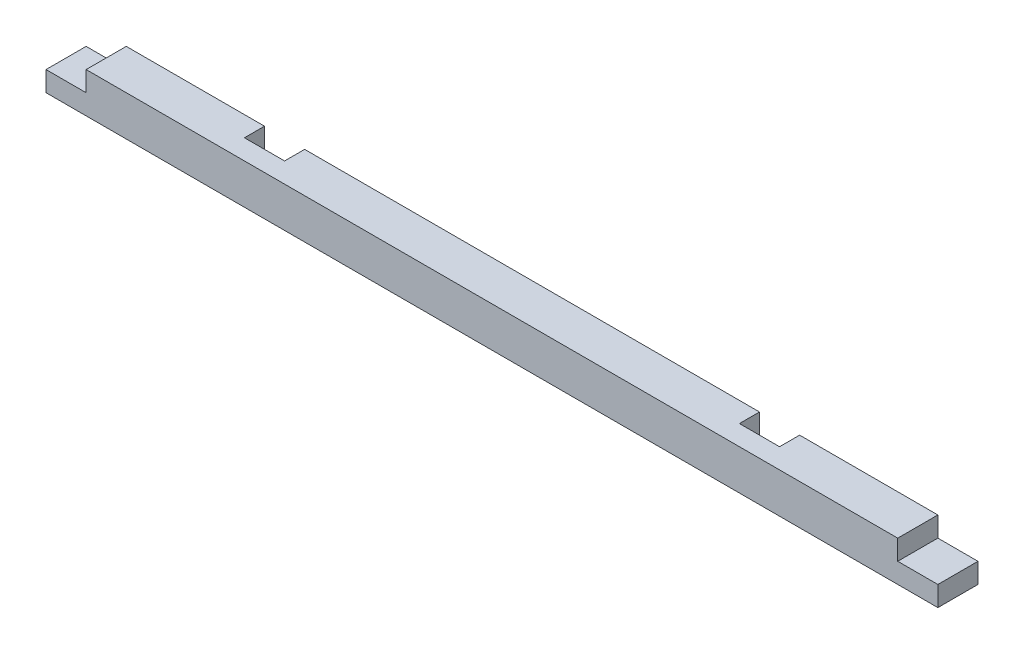
ISO-10303-21;
HEADER;
FILE_DESCRIPTION(('STEP AP214'),'2;1');
FILE_NAME('part.step','',(''),(''),'','','');
FILE_SCHEMA(('AUTOMOTIVE_DESIGN { 1 0 10303 214 1 1 1 1 }'));
ENDSEC;
DATA;
#1=APPLICATION_CONTEXT('core data for automotive mechanical design processes');
#2=APPLICATION_PROTOCOL_DEFINITION('international standard','automotive_design',2000,#1);
#3=PRODUCT_CONTEXT('',#1,'mechanical');
#4=PRODUCT('Part','Part','',(#3));
#5=PRODUCT_RELATED_PRODUCT_CATEGORY('part','',(#4));
#6=PRODUCT_DEFINITION_FORMATION('','',#4);
#7=PRODUCT_DEFINITION_CONTEXT('part definition',#1,'design');
#8=PRODUCT_DEFINITION('design','',#6,#7);
#9=PRODUCT_DEFINITION_SHAPE('','',#8);
#10=(LENGTH_UNIT() NAMED_UNIT(*) SI_UNIT(.MILLI.,.METRE.));
#11=(NAMED_UNIT(*) PLANE_ANGLE_UNIT() SI_UNIT($,.RADIAN.));
#12=(NAMED_UNIT(*) SI_UNIT($,.STERADIAN.) SOLID_ANGLE_UNIT());
#13=UNCERTAINTY_MEASURE_WITH_UNIT(LENGTH_MEASURE(1.E-05),#10,'distance_accuracy_value','');
#14=(GEOMETRIC_REPRESENTATION_CONTEXT(3) GLOBAL_UNCERTAINTY_ASSIGNED_CONTEXT((#13)) GLOBAL_UNIT_ASSIGNED_CONTEXT((#10,
#11,#12)) REPRESENTATION_CONTEXT('',''));
#15=CARTESIAN_POINT('',(0.,0.,0.));
#16=DIRECTION('',(0.,0.,1.));
#17=DIRECTION('',(1.,0.,0.));
#18=AXIS2_PLACEMENT_3D('',#15,#16,#17);
#19=CARTESIAN_POINT('',(2000.,0.,-90.));
#20=DIRECTION('',(0.,0.,1.));
#21=DIRECTION('',(0.,-1.,0.));
#22=AXIS2_PLACEMENT_3D('',#19,#20,#21);
#23=PLANE('',#22);
#24=DIRECTION('',(-1.,0.,0.));
#25=VECTOR('',#24,1.);
#26=CARTESIAN_POINT('',(2000.,90.,-90.));
#27=LINE('',#26,#25);
#28=CARTESIAN_POINT('',(400.,90.,-90.));
#29=VERTEX_POINT('',#28);
#30=CARTESIAN_POINT('',(90.,90.,-90.));
#31=VERTEX_POINT('',#30);
#32=EDGE_CURVE('E248',#29,#31,#27,.T.);
#33=ORIENTED_EDGE('',*,*,#32,.F.);
#34=DIRECTION('',(0.,1.,0.));
#35=VECTOR('',#34,1.);
#36=CARTESIAN_POINT('',(400.,90.,-90.));
#37=LINE('',#36,#35);
#38=CARTESIAN_POINT('',(400.,0.,-90.));
#39=VERTEX_POINT('',#38);
#40=EDGE_CURVE('E265',#39,#29,#37,.T.);
#41=ORIENTED_EDGE('',*,*,#40,.F.);
#42=DIRECTION('',(-1.,0.,0.));
#43=VECTOR('',#42,1.);
#44=CARTESIAN_POINT('',(2000.,0.,-90.));
#45=LINE('',#44,#43);
#46=CARTESIAN_POINT('',(0.,0.,-90.));
#47=VERTEX_POINT('',#46);
#48=EDGE_CURVE('E251',#39,#47,#45,.T.);
#49=ORIENTED_EDGE('',*,*,#48,.T.);
#50=DIRECTION('',(0.,1.,0.));
#51=VECTOR('',#50,1.);
#52=CARTESIAN_POINT('',(0.,0.,-90.));
#53=LINE('',#52,#51);
#54=CARTESIAN_POINT('',(0.,45.,-90.));
#55=VERTEX_POINT('',#54);
#56=EDGE_CURVE('E235',#47,#55,#53,.T.);
#57=ORIENTED_EDGE('',*,*,#56,.T.);
#58=DIRECTION('',(-1.,0.,0.));
#59=VECTOR('',#58,1.);
#60=CARTESIAN_POINT('',(0.,45.,-90.));
#61=LINE('',#60,#59);
#62=CARTESIAN_POINT('',(90.,45.,-90.));
#63=VERTEX_POINT('',#62);
#64=EDGE_CURVE('E221',#63,#55,#61,.T.);
#65=ORIENTED_EDGE('',*,*,#64,.F.);
#66=DIRECTION('',(0.,1.,0.));
#67=VECTOR('',#66,1.);
#68=CARTESIAN_POINT('',(90.,45.,-90.));
#69=LINE('',#68,#67);
#70=EDGE_CURVE('E226',#63,#31,#69,.T.);
#71=ORIENTED_EDGE('',*,*,#70,.T.);
#72=EDGE_LOOP('',(#33,#41,#49,#57,#65,#71));
#73=FACE_BOUND('',#72,.T.);
#74=ADVANCED_FACE('F32',(#73),#23,.F.);
#75=CARTESIAN_POINT('',(2000.,0.,-90.));
#76=VERTEX_POINT('',#75);
#77=CARTESIAN_POINT('',(1600.,0.,-90.));
#78=VERTEX_POINT('',#77);
#79=EDGE_CURVE('E40',#76,#78,#45,.T.);
#80=ORIENTED_EDGE('',*,*,#79,.T.);
#81=DIRECTION('',(0.,-1.,0.));
#82=VECTOR('',#81,1.);
#83=CARTESIAN_POINT('',(1600.,90.,-90.));
#84=LINE('',#83,#82);
#85=CARTESIAN_POINT('',(1600.,90.,-90.));
#86=VERTEX_POINT('',#85);
#87=EDGE_CURVE('E184',#86,#78,#84,.T.);
#88=ORIENTED_EDGE('',*,*,#87,.F.);
#89=CARTESIAN_POINT('',(1910.,90.,-90.));
#90=VERTEX_POINT('',#89);
#91=EDGE_CURVE('E249',#90,#86,#27,.T.);
#92=ORIENTED_EDGE('',*,*,#91,.F.);
#93=DIRECTION('',(0.,1.,0.));
#94=VECTOR('',#93,1.);
#95=CARTESIAN_POINT('',(1910.,45.,-90.));
#96=LINE('',#95,#94);
#97=CARTESIAN_POINT('',(1910.,45.,-90.));
#98=VERTEX_POINT('',#97);
#99=EDGE_CURVE('E206',#98,#90,#96,.T.);
#100=ORIENTED_EDGE('',*,*,#99,.F.);
#101=DIRECTION('',(-1.,0.,0.));
#102=VECTOR('',#101,1.);
#103=CARTESIAN_POINT('',(2000.,45.,-90.));
#104=LINE('',#103,#102);
#105=CARTESIAN_POINT('',(2000.,45.,-90.));
#106=VERTEX_POINT('',#105);
#107=EDGE_CURVE('E198',#106,#98,#104,.T.);
#108=ORIENTED_EDGE('',*,*,#107,.F.);
#109=DIRECTION('',(0.,1.,0.));
#110=VECTOR('',#109,1.);
#111=CARTESIAN_POINT('',(2000.,0.,-90.));
#112=LINE('',#111,#110);
#113=EDGE_CURVE('E237',#76,#106,#112,.T.);
#114=ORIENTED_EDGE('',*,*,#113,.F.);
#115=EDGE_LOOP('',(#80,#88,#92,#100,#108,#114));
#116=FACE_BOUND('',#115,.T.);
#117=ADVANCED_FACE('F308',(#116),#23,.F.);
#118=CARTESIAN_POINT('',(0.,0.,0.));
#119=DIRECTION('',(-1.,0.,0.));
#120=DIRECTION('',(0.,0.,1.));
#121=AXIS2_PLACEMENT_3D('',#118,#119,#120);
#122=PLANE('',#121);
#123=DIRECTION('',(0.,-1.,0.));
#124=VECTOR('',#123,1.);
#125=CARTESIAN_POINT('',(0.,0.,0.));
#126=LINE('',#125,#124);
#127=CARTESIAN_POINT('',(0.,45.,0.));
#128=VERTEX_POINT('',#127);
#129=CARTESIAN_POINT('',(0.,0.,0.));
#130=VERTEX_POINT('',#129);
#131=EDGE_CURVE('E229',#128,#130,#126,.T.);
#132=ORIENTED_EDGE('',*,*,#131,.F.);
#133=DIRECTION('',(0.,0.,1.));
#134=VECTOR('',#133,1.);
#135=CARTESIAN_POINT('',(0.,45.,-90.));
#136=LINE('',#135,#134);
#137=EDGE_CURVE('E213',#55,#128,#136,.T.);
#138=ORIENTED_EDGE('',*,*,#137,.F.);
#139=ORIENTED_EDGE('',*,*,#56,.F.);
#140=DIRECTION('',(0.,0.,-1.));
#141=VECTOR('',#140,1.);
#142=CARTESIAN_POINT('',(0.,0.,0.));
#143=LINE('',#142,#141);
#144=EDGE_CURVE('E242',#130,#47,#143,.T.);
#145=ORIENTED_EDGE('',*,*,#144,.F.);
#146=EDGE_LOOP('',(#132,#138,#139,#145));
#147=FACE_BOUND('',#146,.T.);
#148=ADVANCED_FACE('F275',(#147),#122,.T.);
#149=CARTESIAN_POINT('',(2000.,0.,0.));
#150=DIRECTION('',(0.,0.,-1.));
#151=DIRECTION('',(0.,1.,0.));
#152=AXIS2_PLACEMENT_3D('',#149,#150,#151);
#153=PLANE('',#152);
#154=DIRECTION('',(1.,0.,0.));
#155=VECTOR('',#154,1.);
#156=CARTESIAN_POINT('',(2000.,45.,0.));
#157=LINE('',#156,#155);
#158=CARTESIAN_POINT('',(1910.,45.,0.));
#159=VERTEX_POINT('',#158);
#160=CARTESIAN_POINT('',(2000.,45.,0.));
#161=VERTEX_POINT('',#160);
#162=EDGE_CURVE('E204',#159,#161,#157,.T.);
#163=ORIENTED_EDGE('',*,*,#162,.F.);
#164=DIRECTION('',(0.,1.,0.));
#165=VECTOR('',#164,1.);
#166=CARTESIAN_POINT('',(1910.,45.,0.));
#167=LINE('',#166,#165);
#168=CARTESIAN_POINT('',(1910.,90.,0.));
#169=VERTEX_POINT('',#168);
#170=EDGE_CURVE('E208',#159,#169,#167,.T.);
#171=ORIENTED_EDGE('',*,*,#170,.T.);
#172=DIRECTION('',(-1.,0.,0.));
#173=VECTOR('',#172,1.);
#174=CARTESIAN_POINT('',(2000.,90.,0.));
#175=LINE('',#174,#173);
#176=CARTESIAN_POINT('',(90.0000000000001,90.,0.));
#177=VERTEX_POINT('',#176);
#178=EDGE_CURVE('E240',#169,#177,#175,.T.);
#179=ORIENTED_EDGE('',*,*,#178,.T.);
#180=DIRECTION('',(0.,1.,0.));
#181=VECTOR('',#180,1.);
#182=CARTESIAN_POINT('',(90.0000000000001,45.,0.));
#183=LINE('',#182,#181);
#184=CARTESIAN_POINT('',(90.0000000000001,45.,0.));
#185=VERTEX_POINT('',#184);
#186=EDGE_CURVE('E223',#185,#177,#183,.T.);
#187=ORIENTED_EDGE('',*,*,#186,.F.);
#188=DIRECTION('',(1.,0.,0.));
#189=VECTOR('',#188,1.);
#190=CARTESIAN_POINT('',(0.,45.,0.));
#191=LINE('',#190,#189);
#192=EDGE_CURVE('E215',#128,#185,#191,.T.);
#193=ORIENTED_EDGE('',*,*,#192,.F.);
#194=ORIENTED_EDGE('',*,*,#131,.T.);
#195=DIRECTION('',(-1.,0.,0.));
#196=VECTOR('',#195,1.);
#197=CARTESIAN_POINT('',(2000.,0.,0.));
#198=LINE('',#197,#196);
#199=CARTESIAN_POINT('',(2000.,0.,0.));
#200=VERTEX_POINT('',#199);
#201=EDGE_CURVE('E11',#200,#130,#198,.T.);
#202=ORIENTED_EDGE('',*,*,#201,.F.);
#203=DIRECTION('',(0.,-1.,0.));
#204=VECTOR('',#203,1.);
#205=CARTESIAN_POINT('',(2000.,0.,0.));
#206=LINE('',#205,#204);
#207=EDGE_CURVE('E232',#161,#200,#206,.T.);
#208=ORIENTED_EDGE('',*,*,#207,.F.);
#209=EDGE_LOOP('',(#163,#171,#179,#187,#193,#194,#202,#208));
#210=FACE_BOUND('',#209,.T.);
#211=ADVANCED_FACE('F34',(#210),#153,.F.);
#212=CARTESIAN_POINT('',(2000.,0.,0.));
#213=DIRECTION('',(0.,1.,0.));
#214=DIRECTION('',(0.,0.,1.));
#215=AXIS2_PLACEMENT_3D('',#212,#213,#214);
#216=PLANE('',#215);
#217=ORIENTED_EDGE('',*,*,#48,.F.);
#218=DIRECTION('',(0.,0.,-1.));
#219=VECTOR('',#218,1.);
#220=CARTESIAN_POINT('',(400.,0.,-45.));
#221=LINE('',#220,#219);
#222=CARTESIAN_POINT('',(400.,0.,-45.));
#223=VERTEX_POINT('',#222);
#224=EDGE_CURVE('E169',#223,#39,#221,.T.);
#225=ORIENTED_EDGE('',*,*,#224,.F.);
#226=DIRECTION('',(-1.,0.,0.));
#227=VECTOR('',#226,1.);
#228=CARTESIAN_POINT('',(400.,0.,-45.));
#229=LINE('',#228,#227);
#230=CARTESIAN_POINT('',(490.,0.,-45.));
#231=VERTEX_POINT('',#230);
#232=EDGE_CURVE('E154',#231,#223,#229,.T.);
#233=ORIENTED_EDGE('',*,*,#232,.F.);
#234=DIRECTION('',(0.,0.,-1.));
#235=VECTOR('',#234,1.);
#236=CARTESIAN_POINT('',(490.,0.,-45.));
#237=LINE('',#236,#235);
#238=CARTESIAN_POINT('',(490.,0.,-90.));
#239=VERTEX_POINT('',#238);
#240=EDGE_CURVE('E152',#231,#239,#237,.T.);
#241=ORIENTED_EDGE('',*,*,#240,.T.);
#242=CARTESIAN_POINT('',(1510.,0.,-90.));
#243=VERTEX_POINT('',#242);
#244=EDGE_CURVE('E253',#243,#239,#45,.T.);
#245=ORIENTED_EDGE('',*,*,#244,.F.);
#246=DIRECTION('',(0.,0.,-1.));
#247=VECTOR('',#246,1.);
#248=CARTESIAN_POINT('',(1510.,0.,-45.));
#249=LINE('',#248,#247);
#250=CARTESIAN_POINT('',(1510.,0.,-45.));
#251=VERTEX_POINT('',#250);
#252=EDGE_CURVE('E192',#251,#243,#249,.T.);
#253=ORIENTED_EDGE('',*,*,#252,.F.);
#254=DIRECTION('',(-1.,0.,0.));
#255=VECTOR('',#254,1.);
#256=CARTESIAN_POINT('',(1600.,0.,-45.));
#257=LINE('',#256,#255);
#258=CARTESIAN_POINT('',(1600.,0.,-45.));
#259=VERTEX_POINT('',#258);
#260=EDGE_CURVE('E177',#259,#251,#257,.T.);
#261=ORIENTED_EDGE('',*,*,#260,.F.);
#262=DIRECTION('',(0.,0.,-1.));
#263=VECTOR('',#262,1.);
#264=CARTESIAN_POINT('',(1600.,0.,-45.));
#265=LINE('',#264,#263);
#266=EDGE_CURVE('E183',#259,#78,#265,.T.);
#267=ORIENTED_EDGE('',*,*,#266,.T.);
#268=ORIENTED_EDGE('',*,*,#79,.F.);
#269=DIRECTION('',(0.,0.,-1.));
#270=VECTOR('',#269,1.);
#271=CARTESIAN_POINT('',(2000.,0.,0.));
#272=LINE('',#271,#270);
#273=EDGE_CURVE('E234',#200,#76,#272,.T.);
#274=ORIENTED_EDGE('',*,*,#273,.F.);
#275=ORIENTED_EDGE('',*,*,#201,.T.);
#276=ORIENTED_EDGE('',*,*,#144,.T.);
#277=EDGE_LOOP('',(#217,#225,#233,#241,#245,#253,#261,#267,#268,#274,#275,#276));
#278=FACE_BOUND('',#277,.T.);
#279=ADVANCED_FACE('F269',(#278),#216,.F.);
#280=ORIENTED_EDGE('',*,*,#244,.T.);
#281=DIRECTION('',(0.,-1.,0.));
#282=VECTOR('',#281,1.);
#283=CARTESIAN_POINT('',(490.,90.,-90.));
#284=LINE('',#283,#282);
#285=CARTESIAN_POINT('',(490.,90.,-90.));
#286=VERTEX_POINT('',#285);
#287=EDGE_CURVE('E289',#286,#239,#284,.T.);
#288=ORIENTED_EDGE('',*,*,#287,.F.);
#289=CARTESIAN_POINT('',(1510.,90.,-90.));
#290=VERTEX_POINT('',#289);
#291=EDGE_CURVE('E166',#290,#286,#27,.T.);
#292=ORIENTED_EDGE('',*,*,#291,.F.);
#293=DIRECTION('',(0.,1.,0.));
#294=VECTOR('',#293,1.);
#295=CARTESIAN_POINT('',(1510.,90.,-90.));
#296=LINE('',#295,#294);
#297=EDGE_CURVE('E178',#243,#290,#296,.T.);
#298=ORIENTED_EDGE('',*,*,#297,.F.);
#299=EDGE_LOOP('',(#280,#288,#292,#298));
#300=FACE_BOUND('',#299,.T.);
#301=ADVANCED_FACE('F298',(#300),#23,.F.);
#302=CARTESIAN_POINT('',(2000.,90.,0.));
#303=DIRECTION('',(0.,-1.,0.));
#304=DIRECTION('',(0.,0.,-1.));
#305=AXIS2_PLACEMENT_3D('',#302,#303,#304);
#306=PLANE('',#305);
#307=DIRECTION('',(1.,0.,0.));
#308=VECTOR('',#307,1.);
#309=CARTESIAN_POINT('',(400.,90.,-45.));
#310=LINE('',#309,#308);
#311=CARTESIAN_POINT('',(400.,90.,-45.));
#312=VERTEX_POINT('',#311);
#313=CARTESIAN_POINT('',(490.,90.,-45.));
#314=VERTEX_POINT('',#313);
#315=EDGE_CURVE('E155',#312,#314,#310,.T.);
#316=ORIENTED_EDGE('',*,*,#315,.F.);
#317=DIRECTION('',(0.,0.,-1.));
#318=VECTOR('',#317,1.);
#319=CARTESIAN_POINT('',(400.,90.,-45.));
#320=LINE('',#319,#318);
#321=EDGE_CURVE('E167',#312,#29,#320,.T.);
#322=ORIENTED_EDGE('',*,*,#321,.T.);
#323=ORIENTED_EDGE('',*,*,#32,.T.);
#324=DIRECTION('',(0.,0.,-1.));
#325=VECTOR('',#324,1.);
#326=CARTESIAN_POINT('',(90.,90.,-90.));
#327=LINE('',#326,#325);
#328=EDGE_CURVE('E211',#177,#31,#327,.T.);
#329=ORIENTED_EDGE('',*,*,#328,.F.);
#330=ORIENTED_EDGE('',*,*,#178,.F.);
#331=DIRECTION('',(0.,0.,1.));
#332=VECTOR('',#331,1.);
#333=CARTESIAN_POINT('',(1910.,90.,-90.));
#334=LINE('',#333,#332);
#335=EDGE_CURVE('E189',#90,#169,#334,.T.);
#336=ORIENTED_EDGE('',*,*,#335,.F.);
#337=ORIENTED_EDGE('',*,*,#91,.T.);
#338=DIRECTION('',(0.,0.,-1.));
#339=VECTOR('',#338,1.);
#340=CARTESIAN_POINT('',(1600.,90.,-45.));
#341=LINE('',#340,#339);
#342=CARTESIAN_POINT('',(1600.,90.,-45.));
#343=VERTEX_POINT('',#342);
#344=EDGE_CURVE('E187',#343,#86,#341,.T.);
#345=ORIENTED_EDGE('',*,*,#344,.F.);
#346=DIRECTION('',(1.,0.,0.));
#347=VECTOR('',#346,1.);
#348=CARTESIAN_POINT('',(1600.,90.,-45.));
#349=LINE('',#348,#347);
#350=CARTESIAN_POINT('',(1510.,90.,-45.));
#351=VERTEX_POINT('',#350);
#352=EDGE_CURVE('E181',#351,#343,#349,.T.);
#353=ORIENTED_EDGE('',*,*,#352,.F.);
#354=DIRECTION('',(0.,0.,-1.));
#355=VECTOR('',#354,1.);
#356=CARTESIAN_POINT('',(1510.,90.,-45.));
#357=LINE('',#356,#355);
#358=EDGE_CURVE('E190',#351,#290,#357,.T.);
#359=ORIENTED_EDGE('',*,*,#358,.T.);
#360=ORIENTED_EDGE('',*,*,#291,.T.);
#361=DIRECTION('',(0.,0.,-1.));
#362=VECTOR('',#361,1.);
#363=CARTESIAN_POINT('',(490.,90.,-45.));
#364=LINE('',#363,#362);
#365=EDGE_CURVE('E149',#314,#286,#364,.T.);
#366=ORIENTED_EDGE('',*,*,#365,.F.);
#367=EDGE_LOOP('',(#316,#322,#323,#329,#330,#336,#337,#345,#353,#359,#360,#366));
#368=FACE_BOUND('',#367,.T.);
#369=ADVANCED_FACE('F163',(#368),#306,.F.);
#370=CARTESIAN_POINT('',(2000.,0.,0.));
#371=DIRECTION('',(-1.,0.,0.));
#372=DIRECTION('',(0.,0.,1.));
#373=AXIS2_PLACEMENT_3D('',#370,#371,#372);
#374=PLANE('',#373);
#375=ORIENTED_EDGE('',*,*,#113,.T.);
#376=DIRECTION('',(0.,0.,-1.));
#377=VECTOR('',#376,1.);
#378=CARTESIAN_POINT('',(2000.,45.,-90.));
#379=LINE('',#378,#377);
#380=EDGE_CURVE('E196',#161,#106,#379,.T.);
#381=ORIENTED_EDGE('',*,*,#380,.F.);
#382=ORIENTED_EDGE('',*,*,#207,.T.);
#383=ORIENTED_EDGE('',*,*,#273,.T.);
#384=EDGE_LOOP('',(#375,#381,#382,#383));
#385=FACE_BOUND('',#384,.T.);
#386=ADVANCED_FACE('F318',(#385),#374,.F.);
#387=CARTESIAN_POINT('',(90.,45.,-90.));
#388=DIRECTION('',(1.,0.,0.));
#389=DIRECTION('',(0.,0.,-1.));
#390=AXIS2_PLACEMENT_3D('',#387,#388,#389);
#391=PLANE('',#390);
#392=ORIENTED_EDGE('',*,*,#328,.T.);
#393=ORIENTED_EDGE('',*,*,#70,.F.);
#394=DIRECTION('',(0.,0.,-1.));
#395=VECTOR('',#394,1.);
#396=CARTESIAN_POINT('',(90.,45.,-90.));
#397=LINE('',#396,#395);
#398=EDGE_CURVE('E218',#185,#63,#397,.T.);
#399=ORIENTED_EDGE('',*,*,#398,.F.);
#400=ORIENTED_EDGE('',*,*,#186,.T.);
#401=EDGE_LOOP('',(#392,#393,#399,#400));
#402=FACE_BOUND('',#401,.T.);
#403=ADVANCED_FACE('F285',(#402),#391,.F.);
#404=CARTESIAN_POINT('',(0.,45.,0.));
#405=DIRECTION('',(0.,1.,0.));
#406=DIRECTION('',(0.,0.,1.));
#407=AXIS2_PLACEMENT_3D('',#404,#405,#406);
#408=PLANE('',#407);
#409=ORIENTED_EDGE('',*,*,#137,.T.);
#410=ORIENTED_EDGE('',*,*,#192,.T.);
#411=ORIENTED_EDGE('',*,*,#398,.T.);
#412=ORIENTED_EDGE('',*,*,#64,.T.);
#413=EDGE_LOOP('',(#409,#410,#411,#412));
#414=FACE_BOUND('',#413,.T.);
#415=ADVANCED_FACE('F278',(#414),#408,.T.);
#416=CARTESIAN_POINT('',(1910.,45.,-90.));
#417=DIRECTION('',(-1.,0.,0.));
#418=DIRECTION('',(0.,0.,1.));
#419=AXIS2_PLACEMENT_3D('',#416,#417,#418);
#420=PLANE('',#419);
#421=ORIENTED_EDGE('',*,*,#335,.T.);
#422=ORIENTED_EDGE('',*,*,#170,.F.);
#423=DIRECTION('',(0.,0.,1.));
#424=VECTOR('',#423,1.);
#425=CARTESIAN_POINT('',(1910.,45.,-90.));
#426=LINE('',#425,#424);
#427=EDGE_CURVE('E201',#98,#159,#426,.T.);
#428=ORIENTED_EDGE('',*,*,#427,.F.);
#429=ORIENTED_EDGE('',*,*,#99,.T.);
#430=EDGE_LOOP('',(#421,#422,#428,#429));
#431=FACE_BOUND('',#430,.T.);
#432=ADVANCED_FACE('F311',(#431),#420,.F.);
#433=CARTESIAN_POINT('',(0.,45.,0.));
#434=DIRECTION('',(0.,-1.,0.));
#435=DIRECTION('',(0.,0.,-1.));
#436=AXIS2_PLACEMENT_3D('',#433,#434,#435);
#437=PLANE('',#436);
#438=ORIENTED_EDGE('',*,*,#380,.T.);
#439=ORIENTED_EDGE('',*,*,#107,.T.);
#440=ORIENTED_EDGE('',*,*,#427,.T.);
#441=ORIENTED_EDGE('',*,*,#162,.T.);
#442=EDGE_LOOP('',(#438,#439,#440,#441));
#443=FACE_BOUND('',#442,.T.);
#444=ADVANCED_FACE('F315',(#443),#437,.F.);
#445=CARTESIAN_POINT('',(1600.,90.,-45.));
#446=DIRECTION('',(1.,0.,0.));
#447=DIRECTION('',(0.,0.,-1.));
#448=AXIS2_PLACEMENT_3D('',#445,#446,#447);
#449=PLANE('',#448);
#450=ORIENTED_EDGE('',*,*,#87,.T.);
#451=ORIENTED_EDGE('',*,*,#266,.F.);
#452=DIRECTION('',(0.,-1.,0.));
#453=VECTOR('',#452,1.);
#454=CARTESIAN_POINT('',(1600.,90.,-45.));
#455=LINE('',#454,#453);
#456=EDGE_CURVE('E174',#343,#259,#455,.T.);
#457=ORIENTED_EDGE('',*,*,#456,.F.);
#458=ORIENTED_EDGE('',*,*,#344,.T.);
#459=EDGE_LOOP('',(#450,#451,#457,#458));
#460=FACE_BOUND('',#459,.T.);
#461=ADVANCED_FACE('F306',(#460),#449,.F.);
#462=CARTESIAN_POINT('',(1510.,90.,-45.));
#463=DIRECTION('',(-1.,0.,0.));
#464=DIRECTION('',(0.,0.,1.));
#465=AXIS2_PLACEMENT_3D('',#462,#463,#464);
#466=PLANE('',#465);
#467=ORIENTED_EDGE('',*,*,#297,.T.);
#468=ORIENTED_EDGE('',*,*,#358,.F.);
#469=DIRECTION('',(0.,1.,0.));
#470=VECTOR('',#469,1.);
#471=CARTESIAN_POINT('',(1510.,90.,-45.));
#472=LINE('',#471,#470);
#473=EDGE_CURVE('E55',#251,#351,#472,.T.);
#474=ORIENTED_EDGE('',*,*,#473,.F.);
#475=ORIENTED_EDGE('',*,*,#252,.T.);
#476=EDGE_LOOP('',(#467,#468,#474,#475));
#477=FACE_BOUND('',#476,.T.);
#478=ADVANCED_FACE('F300',(#477),#466,.F.);
#479=CARTESIAN_POINT('',(0.,0.,-45.));
#480=DIRECTION('',(0.,0.,-1.));
#481=DIRECTION('',(0.,1.,0.));
#482=AXIS2_PLACEMENT_3D('',#479,#480,#481);
#483=PLANE('',#482);
#484=ORIENTED_EDGE('',*,*,#456,.T.);
#485=ORIENTED_EDGE('',*,*,#260,.T.);
#486=ORIENTED_EDGE('',*,*,#473,.T.);
#487=ORIENTED_EDGE('',*,*,#352,.T.);
#488=EDGE_LOOP('',(#484,#485,#486,#487));
#489=FACE_BOUND('',#488,.T.);
#490=ADVANCED_FACE('F303',(#489),#483,.T.);
#491=CARTESIAN_POINT('',(400.,90.,-45.));
#492=DIRECTION('',(-1.,0.,0.));
#493=DIRECTION('',(0.,-1.,0.));
#494=AXIS2_PLACEMENT_3D('',#491,#492,#493);
#495=PLANE('',#494);
#496=ORIENTED_EDGE('',*,*,#40,.T.);
#497=ORIENTED_EDGE('',*,*,#321,.F.);
#498=DIRECTION('',(0.,1.,0.));
#499=VECTOR('',#498,1.);
#500=CARTESIAN_POINT('',(400.,90.,-45.));
#501=LINE('',#500,#499);
#502=EDGE_CURVE('E47',#223,#312,#501,.T.);
#503=ORIENTED_EDGE('',*,*,#502,.F.);
#504=ORIENTED_EDGE('',*,*,#224,.T.);
#505=EDGE_LOOP('',(#496,#497,#503,#504));
#506=FACE_BOUND('',#505,.T.);
#507=ADVANCED_FACE('F288',(#506),#495,.F.);
#508=CARTESIAN_POINT('',(490.,90.,-45.));
#509=DIRECTION('',(1.,0.,0.));
#510=DIRECTION('',(0.,1.,0.));
#511=AXIS2_PLACEMENT_3D('',#508,#509,#510);
#512=PLANE('',#511);
#513=ORIENTED_EDGE('',*,*,#287,.T.);
#514=ORIENTED_EDGE('',*,*,#240,.F.);
#515=DIRECTION('',(0.,-1.,0.));
#516=VECTOR('',#515,1.);
#517=CARTESIAN_POINT('',(490.,90.,-45.));
#518=LINE('',#517,#516);
#519=EDGE_CURVE('E146',#314,#231,#518,.T.);
#520=ORIENTED_EDGE('',*,*,#519,.F.);
#521=ORIENTED_EDGE('',*,*,#365,.T.);
#522=EDGE_LOOP('',(#513,#514,#520,#521));
#523=FACE_BOUND('',#522,.T.);
#524=ADVANCED_FACE('F147',(#523),#512,.F.);
#525=CARTESIAN_POINT('',(0.,0.,-45.));
#526=DIRECTION('',(0.,0.,1.));
#527=DIRECTION('',(0.,-1.,0.));
#528=AXIS2_PLACEMENT_3D('',#525,#526,#527);
#529=PLANE('',#528);
#530=ORIENTED_EDGE('',*,*,#502,.T.);
#531=ORIENTED_EDGE('',*,*,#315,.T.);
#532=ORIENTED_EDGE('',*,*,#519,.T.);
#533=ORIENTED_EDGE('',*,*,#232,.T.);
#534=EDGE_LOOP('',(#530,#531,#532,#533));
#535=FACE_BOUND('',#534,.T.);
#536=ADVANCED_FACE('F158',(#535),#529,.F.);
#537=CLOSED_SHELL('',(#74,#117,#148,#211,#279,#301,#369,#386,#403,#415,#432,#444,#461,#478,#490,
#507,#524,#536));
#538=MANIFOLD_SOLID_BREP('B2',#537);
#539=ADVANCED_BREP_SHAPE_REPRESENTATION('',(#18,#538),#14);
#540=SHAPE_DEFINITION_REPRESENTATION(#9,#539);
ENDSEC;
END-ISO-10303-21;
